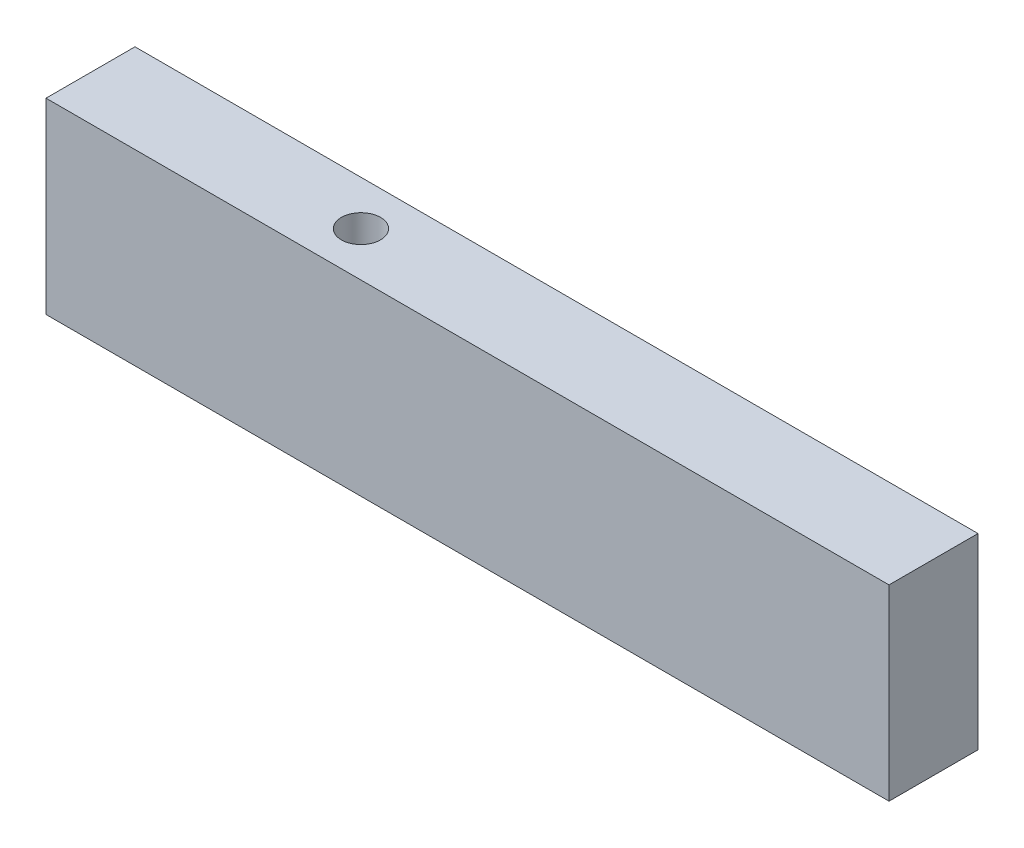
ISO-10303-21;
HEADER;
FILE_DESCRIPTION(('STEP AP214'),'2;1');
FILE_NAME('part.step','',(''),(''),'','','');
FILE_SCHEMA(('AUTOMOTIVE_DESIGN { 1 0 10303 214 1 1 1 1 }'));
ENDSEC;
DATA;
#1=APPLICATION_CONTEXT('core data for automotive mechanical design processes');
#2=APPLICATION_PROTOCOL_DEFINITION('international standard','automotive_design',2000,#1);
#3=PRODUCT_CONTEXT('',#1,'mechanical');
#4=PRODUCT('Part','Part','',(#3));
#5=PRODUCT_RELATED_PRODUCT_CATEGORY('part','',(#4));
#6=PRODUCT_DEFINITION_FORMATION('','',#4);
#7=PRODUCT_DEFINITION_CONTEXT('part definition',#1,'design');
#8=PRODUCT_DEFINITION('design','',#6,#7);
#9=PRODUCT_DEFINITION_SHAPE('','',#8);
#10=(LENGTH_UNIT() NAMED_UNIT(*) SI_UNIT(.MILLI.,.METRE.));
#11=(NAMED_UNIT(*) PLANE_ANGLE_UNIT() SI_UNIT($,.RADIAN.));
#12=(NAMED_UNIT(*) SI_UNIT($,.STERADIAN.) SOLID_ANGLE_UNIT());
#13=UNCERTAINTY_MEASURE_WITH_UNIT(LENGTH_MEASURE(1.E-05),#10,'distance_accuracy_value','');
#14=(GEOMETRIC_REPRESENTATION_CONTEXT(3) GLOBAL_UNCERTAINTY_ASSIGNED_CONTEXT((#13)) GLOBAL_UNIT_ASSIGNED_CONTEXT((#10,
#11,#12)) REPRESENTATION_CONTEXT('',''));
#15=CARTESIAN_POINT('',(0.,0.,0.));
#16=DIRECTION('',(0.,0.,1.));
#17=DIRECTION('',(1.,0.,0.));
#18=AXIS2_PLACEMENT_3D('',#15,#16,#17);
#19=CARTESIAN_POINT('',(82.5,32.5,-8.50000000000001));
#20=DIRECTION('',(0.,0.,-1.));
#21=DIRECTION('',(1.,0.,0.));
#22=AXIS2_PLACEMENT_3D('',#19,#20,#21);
#23=CYLINDRICAL_SURFACE('',#22,3.1);
#24=CARTESIAN_POINT('',(82.5,32.5,-28.5));
#25=DIRECTION('',(0.,0.,1.));
#26=DIRECTION('',(1.,0.,0.));
#27=AXIS2_PLACEMENT_3D('',#24,#25,#26);
#28=CIRCLE('',#27,3.1);
#29=CARTESIAN_POINT('',(85.6,32.5,-28.5));
#30=VERTEX_POINT('',#29);
#31=EDGE_CURVE('E321',#30,#30,#28,.T.);
#32=ORIENTED_EDGE('',*,*,#31,.F.);
#33=EDGE_LOOP('',(#32));
#34=FACE_BOUND('',#33,.T.);
#35=CARTESIAN_POINT('',(82.5,32.5,-19.3));
#36=DIRECTION('',(0.,0.,-1.));
#37=DIRECTION('',(-1.,0.,0.));
#38=AXIS2_PLACEMENT_3D('',#35,#36,#37);
#39=CIRCLE('',#38,3.1);
#40=CARTESIAN_POINT('',(79.4,32.5,-19.3));
#41=VERTEX_POINT('',#40);
#42=EDGE_CURVE('E11',#41,#41,#39,.F.);
#43=ORIENTED_EDGE('',*,*,#42,.T.);
#44=EDGE_LOOP('',(#43));
#45=FACE_BOUND('',#44,.T.);
#46=ADVANCED_FACE('F43',(#34,#45),#23,.F.);
#47=CARTESIAN_POINT('',(-82.5,32.5,-8.5));
#48=DIRECTION('',(0.,0.,-1.));
#49=DIRECTION('',(1.,0.,0.));
#50=AXIS2_PLACEMENT_3D('',#47,#48,#49);
#51=CYLINDRICAL_SURFACE('',#50,3.1);
#52=CARTESIAN_POINT('',(-82.5,32.5,-28.5));
#53=DIRECTION('',(0.,0.,1.));
#54=DIRECTION('',(1.,0.,0.));
#55=AXIS2_PLACEMENT_3D('',#52,#53,#54);
#56=CIRCLE('',#55,3.1);
#57=CARTESIAN_POINT('',(-79.4,32.5,-28.5));
#58=VERTEX_POINT('',#57);
#59=EDGE_CURVE('E103',#58,#58,#56,.T.);
#60=ORIENTED_EDGE('',*,*,#59,.F.);
#61=EDGE_LOOP('',(#60));
#62=FACE_BOUND('',#61,.T.);
#63=CARTESIAN_POINT('',(-82.5,32.5,-19.3));
#64=DIRECTION('',(0.,0.,-1.));
#65=DIRECTION('',(-1.,0.,0.));
#66=AXIS2_PLACEMENT_3D('',#63,#64,#65);
#67=CIRCLE('',#66,3.1);
#68=CARTESIAN_POINT('',(-85.6,32.5,-19.3));
#69=VERTEX_POINT('',#68);
#70=EDGE_CURVE('E51',#69,#69,#67,.F.);
#71=ORIENTED_EDGE('',*,*,#70,.T.);
#72=EDGE_LOOP('',(#71));
#73=FACE_BOUND('',#72,.T.);
#74=ADVANCED_FACE('F140',(#62,#73),#51,.F.);
#75=CARTESIAN_POINT('',(0.,0.,-19.));
#76=DIRECTION('',(0.,-1.,0.));
#77=DIRECTION('',(0.,0.,1.));
#78=AXIS2_PLACEMENT_3D('',#75,#76,#77);
#79=PLANE('',#78);
#80=CARTESIAN_POINT('',(82.5,0.,-19.));
#81=DIRECTION('',(0.,-1.,0.));
#82=DIRECTION('',(0.,0.,-1.));
#83=AXIS2_PLACEMENT_3D('',#80,#81,#82);
#84=CIRCLE('',#83,3.1);
#85=CARTESIAN_POINT('',(82.5,0.,-22.1));
#86=VERTEX_POINT('',#85);
#87=EDGE_CURVE('E114',#86,#86,#84,.T.);
#88=ORIENTED_EDGE('',*,*,#87,.F.);
#89=EDGE_LOOP('',(#88));
#90=FACE_BOUND('',#89,.T.);
#91=DIRECTION('',(0.,0.,1.));
#92=VECTOR('',#91,1.);
#93=CARTESIAN_POINT('',(90.,0.,-28.5));
#94=LINE('',#93,#92);
#95=CARTESIAN_POINT('',(90.,0.,-28.5));
#96=VERTEX_POINT('',#95);
#97=CARTESIAN_POINT('',(90.,0.,-9.5));
#98=VERTEX_POINT('',#97);
#99=EDGE_CURVE('E125',#96,#98,#94,.T.);
#100=ORIENTED_EDGE('',*,*,#99,.T.);
#101=DIRECTION('',(-1.,0.,0.));
#102=VECTOR('',#101,1.);
#103=CARTESIAN_POINT('',(-90.,0.,-9.5));
#104=LINE('',#103,#102);
#105=CARTESIAN_POINT('',(-90.,0.,-9.5));
#106=VERTEX_POINT('',#105);
#107=EDGE_CURVE('E128',#98,#106,#104,.T.);
#108=ORIENTED_EDGE('',*,*,#107,.T.);
#109=DIRECTION('',(0.,0.,-1.));
#110=VECTOR('',#109,1.);
#111=CARTESIAN_POINT('',(-90.,0.,-28.5));
#112=LINE('',#111,#110);
#113=CARTESIAN_POINT('',(-90.,0.,-28.5));
#114=VERTEX_POINT('',#113);
#115=EDGE_CURVE('E131',#106,#114,#112,.T.);
#116=ORIENTED_EDGE('',*,*,#115,.T.);
#117=DIRECTION('',(1.,0.,0.));
#118=VECTOR('',#117,1.);
#119=CARTESIAN_POINT('',(-90.,0.,-28.5));
#120=LINE('',#119,#118);
#121=EDGE_CURVE('E94',#114,#96,#120,.T.);
#122=ORIENTED_EDGE('',*,*,#121,.T.);
#123=EDGE_LOOP('',(#100,#108,#116,#122));
#124=FACE_BOUND('',#123,.T.);
#125=CARTESIAN_POINT('',(-82.5,0.,-19.));
#126=DIRECTION('',(0.,-1.,0.));
#127=DIRECTION('',(0.,0.,-1.));
#128=AXIS2_PLACEMENT_3D('',#125,#126,#127);
#129=CIRCLE('',#128,3.1);
#130=CARTESIAN_POINT('',(-82.5,0.,-22.1));
#131=VERTEX_POINT('',#130);
#132=EDGE_CURVE('E120',#131,#131,#129,.T.);
#133=ORIENTED_EDGE('',*,*,#132,.F.);
#134=EDGE_LOOP('',(#133));
#135=FACE_BOUND('',#134,.T.);
#136=CARTESIAN_POINT('',(-32.25,0.,-19.));
#137=DIRECTION('',(0.,-1.,0.));
#138=DIRECTION('',(0.,0.,-1.));
#139=AXIS2_PLACEMENT_3D('',#136,#137,#138);
#140=CIRCLE('',#139,4.175);
#141=CARTESIAN_POINT('',(-32.25,0.,-23.175));
#142=VERTEX_POINT('',#141);
#143=EDGE_CURVE('E111',#142,#142,#140,.T.);
#144=ORIENTED_EDGE('',*,*,#143,.F.);
#145=EDGE_LOOP('',(#144));
#146=FACE_BOUND('',#145,.T.);
#147=ADVANCED_FACE('F161',(#90,#124,#135,#146),#79,.T.);
#148=CARTESIAN_POINT('',(90.,20.,-28.5));
#149=DIRECTION('',(-1.,0.,0.));
#150=DIRECTION('',(0.,0.,-1.));
#151=AXIS2_PLACEMENT_3D('',#148,#149,#150);
#152=PLANE('',#151);
#153=ORIENTED_EDGE('',*,*,#99,.F.);
#154=DIRECTION('',(0.,-1.,0.));
#155=VECTOR('',#154,1.);
#156=CARTESIAN_POINT('',(90.,20.,-28.5));
#157=LINE('',#156,#155);
#158=CARTESIAN_POINT('',(90.,40.,-28.5));
#159=VERTEX_POINT('',#158);
#160=EDGE_CURVE('E58',#159,#96,#157,.T.);
#161=ORIENTED_EDGE('',*,*,#160,.F.);
#162=DIRECTION('',(0.,0.,1.));
#163=VECTOR('',#162,1.);
#164=CARTESIAN_POINT('',(90.,40.,-9.50000000000001));
#165=LINE('',#164,#163);
#166=CARTESIAN_POINT('',(90.,40.,-9.50000000000001));
#167=VERTEX_POINT('',#166);
#168=EDGE_CURVE('E91',#159,#167,#165,.T.);
#169=ORIENTED_EDGE('',*,*,#168,.T.);
#170=DIRECTION('',(0.,-1.,0.));
#171=VECTOR('',#170,1.);
#172=CARTESIAN_POINT('',(90.,20.,-9.5));
#173=LINE('',#172,#171);
#174=EDGE_CURVE('E136',#167,#98,#173,.T.);
#175=ORIENTED_EDGE('',*,*,#174,.T.);
#176=EDGE_LOOP('',(#153,#161,#169,#175));
#177=FACE_BOUND('',#176,.T.);
#178=ADVANCED_FACE('F45',(#177),#152,.F.);
#179=CARTESIAN_POINT('',(-90.,20.,-9.5));
#180=DIRECTION('',(0.,0.,-1.));
#181=DIRECTION('',(1.,0.,0.));
#182=AXIS2_PLACEMENT_3D('',#179,#180,#181);
#183=PLANE('',#182);
#184=ORIENTED_EDGE('',*,*,#107,.F.);
#185=ORIENTED_EDGE('',*,*,#174,.F.);
#186=DIRECTION('',(-1.,0.,0.));
#187=VECTOR('',#186,1.);
#188=CARTESIAN_POINT('',(-90.,40.,-9.5));
#189=LINE('',#188,#187);
#190=CARTESIAN_POINT('',(-90.,40.,-9.5));
#191=VERTEX_POINT('',#190);
#192=EDGE_CURVE('E108',#167,#191,#189,.T.);
#193=ORIENTED_EDGE('',*,*,#192,.T.);
#194=DIRECTION('',(0.,-1.,0.));
#195=VECTOR('',#194,1.);
#196=CARTESIAN_POINT('',(-90.,20.,-9.5));
#197=LINE('',#196,#195);
#198=EDGE_CURVE('E96',#191,#106,#197,.T.);
#199=ORIENTED_EDGE('',*,*,#198,.T.);
#200=EDGE_LOOP('',(#184,#185,#193,#199));
#201=FACE_BOUND('',#200,.T.);
#202=ADVANCED_FACE('F189',(#201),#183,.F.);
#203=CARTESIAN_POINT('',(-90.,20.,-28.5));
#204=DIRECTION('',(1.,0.,0.));
#205=DIRECTION('',(0.,0.,1.));
#206=AXIS2_PLACEMENT_3D('',#203,#204,#205);
#207=PLANE('',#206);
#208=ORIENTED_EDGE('',*,*,#115,.F.);
#209=ORIENTED_EDGE('',*,*,#198,.F.);
#210=DIRECTION('',(0.,0.,-1.));
#211=VECTOR('',#210,1.);
#212=CARTESIAN_POINT('',(-90.,40.,-9.5));
#213=LINE('',#212,#211);
#214=CARTESIAN_POINT('',(-90.,40.,-28.5));
#215=VERTEX_POINT('',#214);
#216=EDGE_CURVE('E88',#191,#215,#213,.T.);
#217=ORIENTED_EDGE('',*,*,#216,.T.);
#218=DIRECTION('',(0.,-1.,0.));
#219=VECTOR('',#218,1.);
#220=CARTESIAN_POINT('',(-90.,20.,-28.5));
#221=LINE('',#220,#219);
#222=EDGE_CURVE('E66',#215,#114,#221,.T.);
#223=ORIENTED_EDGE('',*,*,#222,.T.);
#224=EDGE_LOOP('',(#208,#209,#217,#223));
#225=FACE_BOUND('',#224,.T.);
#226=ADVANCED_FACE('F98',(#225),#207,.F.);
#227=CARTESIAN_POINT('',(-90.,20.,-28.5));
#228=DIRECTION('',(0.,0.,1.));
#229=DIRECTION('',(-1.,0.,0.));
#230=AXIS2_PLACEMENT_3D('',#227,#228,#229);
#231=PLANE('',#230);
#232=ORIENTED_EDGE('',*,*,#59,.T.);
#233=EDGE_LOOP('',(#232));
#234=FACE_BOUND('',#233,.T.);
#235=ORIENTED_EDGE('',*,*,#31,.T.);
#236=EDGE_LOOP('',(#235));
#237=FACE_BOUND('',#236,.T.);
#238=ORIENTED_EDGE('',*,*,#121,.F.);
#239=ORIENTED_EDGE('',*,*,#222,.F.);
#240=DIRECTION('',(1.,0.,0.));
#241=VECTOR('',#240,1.);
#242=CARTESIAN_POINT('',(-90.,40.,-28.5));
#243=LINE('',#242,#241);
#244=EDGE_CURVE('E85',#215,#159,#243,.T.);
#245=ORIENTED_EDGE('',*,*,#244,.T.);
#246=ORIENTED_EDGE('',*,*,#160,.T.);
#247=EDGE_LOOP('',(#238,#239,#245,#246));
#248=FACE_BOUND('',#247,.T.);
#249=ADVANCED_FACE('F93',(#234,#237,#248),#231,.F.);
#250=CARTESIAN_POINT('',(-82.5,20.,-19.));
#251=DIRECTION('',(0.,-1.,0.));
#252=DIRECTION('',(0.,0.,1.));
#253=AXIS2_PLACEMENT_3D('',#250,#251,#252);
#254=CYLINDRICAL_SURFACE('',#253,3.1);
#255=CARTESIAN_POINT('',(-82.5,20.,-19.));
#256=DIRECTION('',(0.,-1.,0.));
#257=DIRECTION('',(0.,0.,-1.));
#258=AXIS2_PLACEMENT_3D('',#255,#256,#257);
#259=CIRCLE('',#258,3.1);
#260=CARTESIAN_POINT('',(-82.5,20.,-22.1));
#261=VERTEX_POINT('',#260);
#262=EDGE_CURVE('E115',#261,#261,#259,.T.);
#263=ORIENTED_EDGE('',*,*,#262,.F.);
#264=EDGE_LOOP('',(#263));
#265=FACE_BOUND('',#264,.T.);
#266=ORIENTED_EDGE('',*,*,#132,.T.);
#267=EDGE_LOOP('',(#266));
#268=FACE_BOUND('',#267,.T.);
#269=ADVANCED_FACE('F177',(#265,#268),#254,.F.);
#270=CARTESIAN_POINT('',(82.5,20.,-19.));
#271=DIRECTION('',(0.,-1.,0.));
#272=DIRECTION('',(0.,0.,1.));
#273=AXIS2_PLACEMENT_3D('',#270,#271,#272);
#274=CYLINDRICAL_SURFACE('',#273,3.1);
#275=CARTESIAN_POINT('',(82.5,20.,-19.));
#276=DIRECTION('',(0.,-1.,0.));
#277=DIRECTION('',(0.,0.,-1.));
#278=AXIS2_PLACEMENT_3D('',#275,#276,#277);
#279=CIRCLE('',#278,3.1);
#280=CARTESIAN_POINT('',(82.5,20.,-22.1));
#281=VERTEX_POINT('',#280);
#282=EDGE_CURVE('E110',#281,#281,#279,.T.);
#283=ORIENTED_EDGE('',*,*,#282,.F.);
#284=EDGE_LOOP('',(#283));
#285=FACE_BOUND('',#284,.T.);
#286=ORIENTED_EDGE('',*,*,#87,.T.);
#287=EDGE_LOOP('',(#286));
#288=FACE_BOUND('',#287,.T.);
#289=ADVANCED_FACE('F173',(#285,#288),#274,.F.);
#290=CARTESIAN_POINT('',(-32.25,20.,-19.));
#291=DIRECTION('',(0.,-1.,0.));
#292=DIRECTION('',(0.,0.,1.));
#293=AXIS2_PLACEMENT_3D('',#290,#291,#292);
#294=CYLINDRICAL_SURFACE('',#293,4.175);
#295=ORIENTED_EDGE('',*,*,#143,.T.);
#296=EDGE_LOOP('',(#295));
#297=FACE_BOUND('',#296,.T.);
#298=CARTESIAN_POINT('',(-32.25,40.,-19.));
#299=DIRECTION('',(0.,-1.,0.));
#300=DIRECTION('',(0.,0.,-1.));
#301=AXIS2_PLACEMENT_3D('',#298,#299,#300);
#302=CIRCLE('',#301,4.175);
#303=CARTESIAN_POINT('',(-32.25,40.,-23.175));
#304=VERTEX_POINT('',#303);
#305=EDGE_CURVE('E100',#304,#304,#302,.T.);
#306=ORIENTED_EDGE('',*,*,#305,.F.);
#307=EDGE_LOOP('',(#306));
#308=FACE_BOUND('',#307,.T.);
#309=ADVANCED_FACE('F170',(#297,#308),#294,.F.);
#310=CARTESIAN_POINT('',(0.,20.,-19.));
#311=DIRECTION('',(0.,1.,0.));
#312=DIRECTION('',(0.,0.,-1.));
#313=AXIS2_PLACEMENT_3D('',#310,#311,#312);
#314=PLANE('',#313);
#315=ORIENTED_EDGE('',*,*,#282,.T.);
#316=EDGE_LOOP('',(#315));
#317=FACE_BOUND('',#316,.T.);
#318=ADVANCED_FACE('F168',(#317),#314,.F.);
#319=ORIENTED_EDGE('',*,*,#262,.T.);
#320=EDGE_LOOP('',(#319));
#321=FACE_BOUND('',#320,.T.);
#322=ADVANCED_FACE('F152',(#321),#314,.F.);
#323=CARTESIAN_POINT('',(0.,40.,-19.));
#324=DIRECTION('',(0.,1.,0.));
#325=DIRECTION('',(0.,0.,-1.));
#326=AXIS2_PLACEMENT_3D('',#323,#324,#325);
#327=PLANE('',#326);
#328=ORIENTED_EDGE('',*,*,#216,.F.);
#329=ORIENTED_EDGE('',*,*,#192,.F.);
#330=ORIENTED_EDGE('',*,*,#168,.F.);
#331=ORIENTED_EDGE('',*,*,#244,.F.);
#332=EDGE_LOOP('',(#328,#329,#330,#331));
#333=FACE_BOUND('',#332,.T.);
#334=ORIENTED_EDGE('',*,*,#305,.T.);
#335=EDGE_LOOP('',(#334));
#336=FACE_BOUND('',#335,.T.);
#337=ADVANCED_FACE('F86',(#333,#336),#327,.T.);
#338=CARTESIAN_POINT('',(0.,0.,-19.3));
#339=DIRECTION('',(0.,0.,1.));
#340=DIRECTION('',(-1.,0.,0.));
#341=AXIS2_PLACEMENT_3D('',#338,#339,#340);
#342=PLANE('',#341);
#343=ORIENTED_EDGE('',*,*,#70,.F.);
#344=EDGE_LOOP('',(#343));
#345=FACE_BOUND('',#344,.T.);
#346=ADVANCED_FACE('F142',(#345),#342,.F.);
#347=CARTESIAN_POINT('',(82.5,32.5,-19.3));
#348=DIRECTION('',(0.,0.,1.));
#349=DIRECTION('',(-1.,0.,0.));
#350=AXIS2_PLACEMENT_3D('',#347,#348,#349);
#351=PLANE('',#350);
#352=ORIENTED_EDGE('',*,*,#42,.F.);
#353=EDGE_LOOP('',(#352));
#354=FACE_BOUND('',#353,.T.);
#355=ADVANCED_FACE('F144',(#354),#351,.F.);
#356=CLOSED_SHELL('',(#46,#74,#147,#178,#202,#226,#249,#269,#289,#309,#318,#322,#337,#346,#355));
#357=MANIFOLD_SOLID_BREP('B2',#356);
#358=ADVANCED_BREP_SHAPE_REPRESENTATION('',(#18,#357),#14);
#359=SHAPE_DEFINITION_REPRESENTATION(#9,#358);
ENDSEC;
END-ISO-10303-21;
